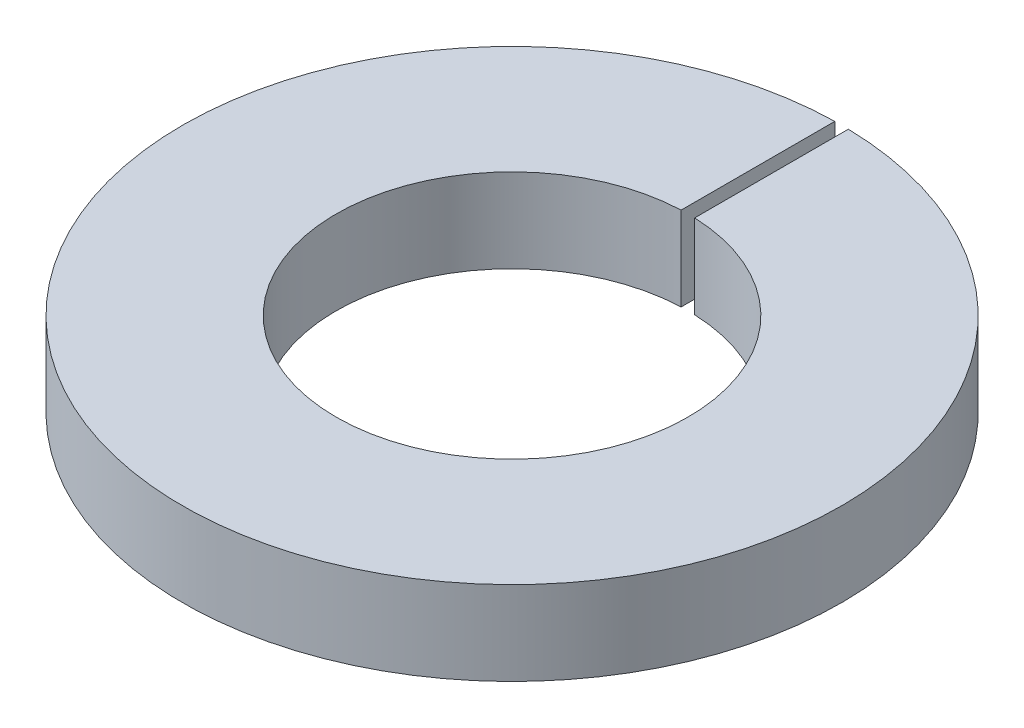
ISO-10303-21;
HEADER;
FILE_DESCRIPTION(('STEP AP214'),'2;1');
FILE_NAME('part.step','',(''),(''),'','','');
FILE_SCHEMA(('AUTOMOTIVE_DESIGN { 1 0 10303 214 1 1 1 1 }'));
ENDSEC;
DATA;
#1=APPLICATION_CONTEXT('core data for automotive mechanical design processes');
#2=APPLICATION_PROTOCOL_DEFINITION('international standard','automotive_design',2000,#1);
#3=PRODUCT_CONTEXT('',#1,'mechanical');
#4=PRODUCT('Part','Part','',(#3));
#5=PRODUCT_RELATED_PRODUCT_CATEGORY('part','',(#4));
#6=PRODUCT_DEFINITION_FORMATION('','',#4);
#7=PRODUCT_DEFINITION_CONTEXT('part definition',#1,'design');
#8=PRODUCT_DEFINITION('design','',#6,#7);
#9=PRODUCT_DEFINITION_SHAPE('','',#8);
#10=(LENGTH_UNIT() NAMED_UNIT(*) SI_UNIT(.MILLI.,.METRE.));
#11=(NAMED_UNIT(*) PLANE_ANGLE_UNIT() SI_UNIT($,.RADIAN.));
#12=(NAMED_UNIT(*) SI_UNIT($,.STERADIAN.) SOLID_ANGLE_UNIT());
#13=UNCERTAINTY_MEASURE_WITH_UNIT(LENGTH_MEASURE(1.E-05),#10,'distance_accuracy_value','');
#14=(GEOMETRIC_REPRESENTATION_CONTEXT(3) GLOBAL_UNCERTAINTY_ASSIGNED_CONTEXT((#13)) GLOBAL_UNIT_ASSIGNED_CONTEXT((#10,
#11,#12)) REPRESENTATION_CONTEXT('',''));
#15=CARTESIAN_POINT('',(0.,0.,0.));
#16=DIRECTION('',(0.,0.,1.));
#17=DIRECTION('',(1.,0.,0.));
#18=AXIS2_PLACEMENT_3D('',#15,#16,#17);
#19=CARTESIAN_POINT('',(0.,1.5748,0.));
#20=DIRECTION('',(0.,-1.,0.));
#21=DIRECTION('',(0.,0.,-1.));
#22=AXIS2_PLACEMENT_3D('',#19,#20,#21);
#23=CYLINDRICAL_SURFACE('',#22,3.302);
#24=CARTESIAN_POINT('',(0.,0.,0.));
#25=DIRECTION('',(0.,-1.,0.));
#26=DIRECTION('',(0.,0.,1.));
#27=AXIS2_PLACEMENT_3D('',#24,#25,#26);
#28=CIRCLE('',#27,3.302);
#29=CARTESIAN_POINT('',(0.127,0.,-3.29955678841871));
#30=VERTEX_POINT('',#29);
#31=CARTESIAN_POINT('',(-0.127,0.,-3.29955678841871));
#32=VERTEX_POINT('',#31);
#33=EDGE_CURVE('E97',#30,#32,#28,.T.);
#34=ORIENTED_EDGE('',*,*,#33,.T.);
#35=DIRECTION('',(0.,-1.,0.));
#36=VECTOR('',#35,1.);
#37=CARTESIAN_POINT('',(-0.127,1.5748,-3.29955678841871));
#38=LINE('',#37,#36);
#39=CARTESIAN_POINT('',(-0.127,1.5748,-3.29955678841871));
#40=VERTEX_POINT('',#39);
#41=EDGE_CURVE('E11',#40,#32,#38,.T.);
#42=ORIENTED_EDGE('',*,*,#41,.F.);
#43=CARTESIAN_POINT('',(0.,1.5748,0.));
#44=DIRECTION('',(0.,-1.,0.));
#45=DIRECTION('',(0.,0.,1.));
#46=AXIS2_PLACEMENT_3D('',#43,#44,#45);
#47=CIRCLE('',#46,3.302);
#48=CARTESIAN_POINT('',(0.127,1.5748,-3.29955678841871));
#49=VERTEX_POINT('',#48);
#50=EDGE_CURVE('E85',#49,#40,#47,.T.);
#51=ORIENTED_EDGE('',*,*,#50,.F.);
#52=DIRECTION('',(0.,-1.,0.));
#53=VECTOR('',#52,1.);
#54=CARTESIAN_POINT('',(0.127,1.5748,-3.29955678841871));
#55=LINE('',#54,#53);
#56=EDGE_CURVE('E93',#49,#30,#55,.T.);
#57=ORIENTED_EDGE('',*,*,#56,.T.);
#58=EDGE_LOOP('',(#34,#42,#51,#57));
#59=FACE_BOUND('',#58,.T.);
#60=ADVANCED_FACE('F34',(#59),#23,.F.);
#61=CARTESIAN_POINT('',(-0.127,1.5748,-6.18359596108931));
#62=DIRECTION('',(-1.,0.,0.));
#63=DIRECTION('',(0.,0.,1.));
#64=AXIS2_PLACEMENT_3D('',#61,#62,#63);
#65=PLANE('',#64);
#66=DIRECTION('',(0.,0.,-1.));
#67=VECTOR('',#66,1.);
#68=CARTESIAN_POINT('',(-0.127,0.,-6.18359596108931));
#69=LINE('',#68,#67);
#70=CARTESIAN_POINT('',(-0.126999999999997,0.,-6.18359596108931));
#71=VERTEX_POINT('',#70);
#72=EDGE_CURVE('E89',#32,#71,#69,.T.);
#73=ORIENTED_EDGE('',*,*,#72,.T.);
#74=DIRECTION('',(0.,-1.,0.));
#75=VECTOR('',#74,1.);
#76=CARTESIAN_POINT('',(-0.126999999999997,1.5748,-6.18359596108931));
#77=LINE('',#76,#75);
#78=CARTESIAN_POINT('',(-0.126999999999997,1.5748,-6.18359596108931));
#79=VERTEX_POINT('',#78);
#80=EDGE_CURVE('E42',#79,#71,#77,.T.);
#81=ORIENTED_EDGE('',*,*,#80,.F.);
#82=DIRECTION('',(0.,0.,-1.));
#83=VECTOR('',#82,1.);
#84=CARTESIAN_POINT('',(-0.127,1.5748,-6.18359596108931));
#85=LINE('',#84,#83);
#86=EDGE_CURVE('E80',#40,#79,#85,.T.);
#87=ORIENTED_EDGE('',*,*,#86,.F.);
#88=ORIENTED_EDGE('',*,*,#41,.T.);
#89=EDGE_LOOP('',(#73,#81,#87,#88));
#90=FACE_BOUND('',#89,.T.);
#91=ADVANCED_FACE('F88',(#90),#65,.F.);
#92=CARTESIAN_POINT('',(0.,1.5748,0.));
#93=DIRECTION('',(0.,-1.,0.));
#94=DIRECTION('',(0.,0.,-1.));
#95=AXIS2_PLACEMENT_3D('',#92,#93,#94);
#96=CYLINDRICAL_SURFACE('',#95,6.1849);
#97=CARTESIAN_POINT('',(0.,0.,0.));
#98=DIRECTION('',(0.,1.,0.));
#99=DIRECTION('',(0.,0.,1.));
#100=AXIS2_PLACEMENT_3D('',#97,#98,#99);
#101=CIRCLE('',#100,6.1849);
#102=CARTESIAN_POINT('',(0.127,0.,-6.18359596108931));
#103=VERTEX_POINT('',#102);
#104=EDGE_CURVE('E67',#71,#103,#101,.T.);
#105=ORIENTED_EDGE('',*,*,#104,.T.);
#106=DIRECTION('',(0.,-1.,0.));
#107=VECTOR('',#106,1.);
#108=CARTESIAN_POINT('',(0.127,1.5748,-6.18359596108931));
#109=LINE('',#108,#107);
#110=CARTESIAN_POINT('',(0.127,1.5748,-6.18359596108931));
#111=VERTEX_POINT('',#110);
#112=EDGE_CURVE('E90',#111,#103,#109,.T.);
#113=ORIENTED_EDGE('',*,*,#112,.F.);
#114=CARTESIAN_POINT('',(0.,1.5748,0.));
#115=DIRECTION('',(0.,1.,0.));
#116=DIRECTION('',(0.,0.,1.));
#117=AXIS2_PLACEMENT_3D('',#114,#115,#116);
#118=CIRCLE('',#117,6.1849);
#119=EDGE_CURVE('E83',#79,#111,#118,.T.);
#120=ORIENTED_EDGE('',*,*,#119,.F.);
#121=ORIENTED_EDGE('',*,*,#80,.T.);
#122=EDGE_LOOP('',(#105,#113,#120,#121));
#123=FACE_BOUND('',#122,.T.);
#124=ADVANCED_FACE('F91',(#123),#96,.T.);
#125=CARTESIAN_POINT('',(0.127,1.5748,-6.18359596108931));
#126=DIRECTION('',(1.,0.,0.));
#127=DIRECTION('',(0.,0.,-1.));
#128=AXIS2_PLACEMENT_3D('',#125,#126,#127);
#129=PLANE('',#128);
#130=DIRECTION('',(0.,0.,1.));
#131=VECTOR('',#130,1.);
#132=CARTESIAN_POINT('',(0.127,0.,-6.18359596108931));
#133=LINE('',#132,#131);
#134=EDGE_CURVE('E73',#103,#30,#133,.T.);
#135=ORIENTED_EDGE('',*,*,#134,.T.);
#136=ORIENTED_EDGE('',*,*,#56,.F.);
#137=DIRECTION('',(0.,0.,1.));
#138=VECTOR('',#137,1.);
#139=CARTESIAN_POINT('',(0.127,1.5748,-6.18359596108931));
#140=LINE('',#139,#138);
#141=EDGE_CURVE('E50',#111,#49,#140,.T.);
#142=ORIENTED_EDGE('',*,*,#141,.F.);
#143=ORIENTED_EDGE('',*,*,#112,.T.);
#144=EDGE_LOOP('',(#135,#136,#142,#143));
#145=FACE_BOUND('',#144,.T.);
#146=ADVANCED_FACE('F104',(#145),#129,.F.);
#147=CARTESIAN_POINT('',(0.,1.5748,0.));
#148=DIRECTION('',(0.,1.,0.));
#149=DIRECTION('',(0.,0.,1.));
#150=AXIS2_PLACEMENT_3D('',#147,#148,#149);
#151=PLANE('',#150);
#152=ORIENTED_EDGE('',*,*,#50,.T.);
#153=ORIENTED_EDGE('',*,*,#86,.T.);
#154=ORIENTED_EDGE('',*,*,#119,.T.);
#155=ORIENTED_EDGE('',*,*,#141,.T.);
#156=EDGE_LOOP('',(#152,#153,#154,#155));
#157=FACE_BOUND('',#156,.T.);
#158=ADVANCED_FACE('F81',(#157),#151,.T.);
#159=CARTESIAN_POINT('',(0.,0.,0.));
#160=DIRECTION('',(0.,1.,0.));
#161=DIRECTION('',(0.,0.,1.));
#162=AXIS2_PLACEMENT_3D('',#159,#160,#161);
#163=PLANE('',#162);
#164=ORIENTED_EDGE('',*,*,#33,.F.);
#165=ORIENTED_EDGE('',*,*,#134,.F.);
#166=ORIENTED_EDGE('',*,*,#104,.F.);
#167=ORIENTED_EDGE('',*,*,#72,.F.);
#168=EDGE_LOOP('',(#164,#165,#166,#167));
#169=FACE_BOUND('',#168,.T.);
#170=ADVANCED_FACE('F107',(#169),#163,.F.);
#171=CLOSED_SHELL('',(#60,#91,#124,#146,#158,#170));
#172=MANIFOLD_SOLID_BREP('B2',#171);
#173=ADVANCED_BREP_SHAPE_REPRESENTATION('',(#18,#172),#14);
#174=SHAPE_DEFINITION_REPRESENTATION(#9,#173);
ENDSEC;
END-ISO-10303-21;
